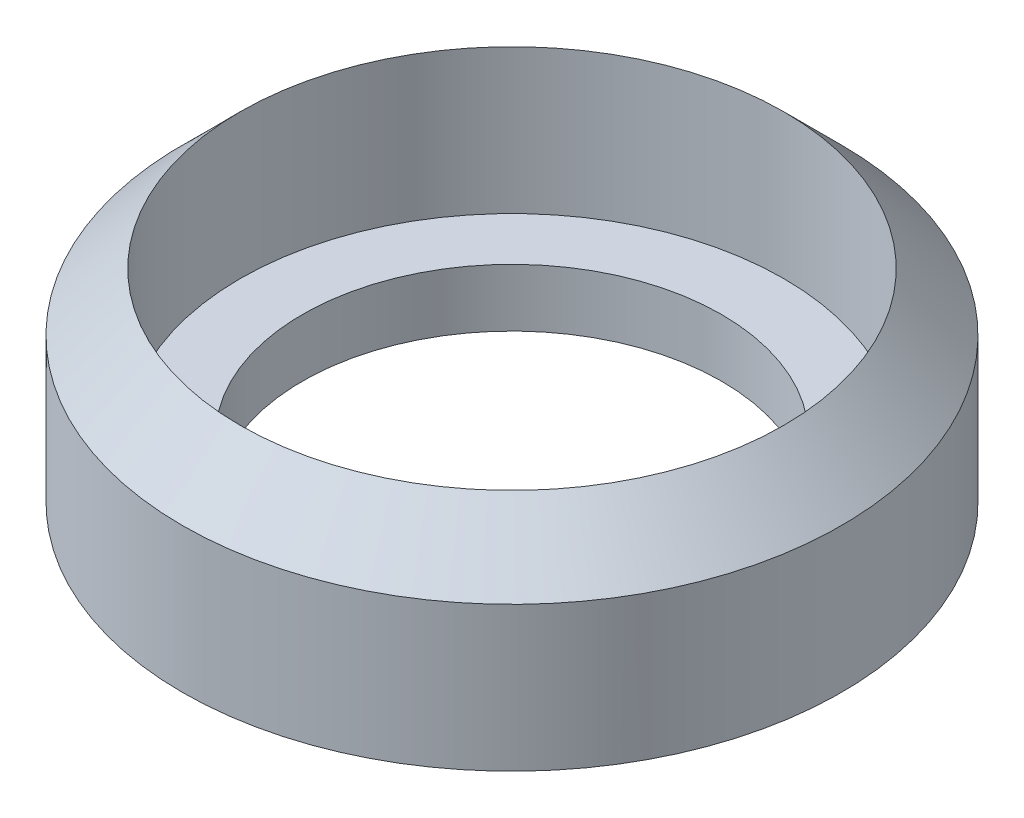
ISO-10303-21;
HEADER;
FILE_DESCRIPTION(('STEP AP214'),'2;1');
FILE_NAME('part.step','',(''),(''),'','','');
FILE_SCHEMA(('AUTOMOTIVE_DESIGN { 1 0 10303 214 1 1 1 1 }'));
ENDSEC;
DATA;
#1=APPLICATION_CONTEXT('core data for automotive mechanical design processes');
#2=APPLICATION_PROTOCOL_DEFINITION('international standard','automotive_design',2000,#1);
#3=PRODUCT_CONTEXT('',#1,'mechanical');
#4=PRODUCT('Part','Part','',(#3));
#5=PRODUCT_RELATED_PRODUCT_CATEGORY('part','',(#4));
#6=PRODUCT_DEFINITION_FORMATION('','',#4);
#7=PRODUCT_DEFINITION_CONTEXT('part definition',#1,'design');
#8=PRODUCT_DEFINITION('design','',#6,#7);
#9=PRODUCT_DEFINITION_SHAPE('','',#8);
#10=(LENGTH_UNIT() NAMED_UNIT(*) SI_UNIT(.MILLI.,.METRE.));
#11=(NAMED_UNIT(*) PLANE_ANGLE_UNIT() SI_UNIT($,.RADIAN.));
#12=(NAMED_UNIT(*) SI_UNIT($,.STERADIAN.) SOLID_ANGLE_UNIT());
#13=UNCERTAINTY_MEASURE_WITH_UNIT(LENGTH_MEASURE(1.E-05),#10,'distance_accuracy_value','');
#14=(GEOMETRIC_REPRESENTATION_CONTEXT(3) GLOBAL_UNCERTAINTY_ASSIGNED_CONTEXT((#13)) GLOBAL_UNIT_ASSIGNED_CONTEXT((#10,
#11,#12)) REPRESENTATION_CONTEXT('',''));
#15=CARTESIAN_POINT('',(0.,0.,0.));
#16=DIRECTION('',(0.,0.,1.));
#17=DIRECTION('',(1.,0.,0.));
#18=AXIS2_PLACEMENT_3D('',#15,#16,#17);
#19=CARTESIAN_POINT('',(36.2500000000001,0.,0.));
#20=DIRECTION('',(0.,1.,0.));
#21=DIRECTION('',(0.,0.,1.));
#22=AXIS2_PLACEMENT_3D('',#19,#20,#21);
#23=PLANE('',#22);
#24=CARTESIAN_POINT('',(0.,0.,0.));
#25=DIRECTION('',(0.,1.,0.));
#26=DIRECTION('',(0.,0.,1.));
#27=AXIS2_PLACEMENT_3D('',#24,#25,#26);
#28=CIRCLE('',#27,57.);
#29=CARTESIAN_POINT('',(0.,0.,57.));
#30=VERTEX_POINT('',#29);
#31=EDGE_CURVE('E50',#30,#30,#28,.T.);
#32=ORIENTED_EDGE('',*,*,#31,.F.);
#33=EDGE_LOOP('',(#32));
#34=FACE_BOUND('',#33,.T.);
#35=CARTESIAN_POINT('',(0.,0.,0.));
#36=DIRECTION('',(0.,1.,0.));
#37=DIRECTION('',(0.,0.,1.));
#38=AXIS2_PLACEMENT_3D('',#35,#36,#37);
#39=CIRCLE('',#38,36.2500000000001);
#40=CARTESIAN_POINT('',(0.,0.,36.2500000000001));
#41=VERTEX_POINT('',#40);
#42=EDGE_CURVE('E70',#41,#41,#39,.T.);
#43=ORIENTED_EDGE('',*,*,#42,.T.);
#44=EDGE_LOOP('',(#43));
#45=FACE_BOUND('',#44,.T.);
#46=ADVANCED_FACE('F41',(#34,#45),#23,.F.);
#47=CARTESIAN_POINT('',(0.,630.278330927536,0.));
#48=DIRECTION('',(0.,1.,0.));
#49=DIRECTION('',(0.,0.,1.));
#50=AXIS2_PLACEMENT_3D('',#47,#48,#49);
#51=CYLINDRICAL_SURFACE('',#50,57.0000000000001);
#52=CARTESIAN_POINT('',(0.,24.9999999999999,0.));
#53=DIRECTION('',(0.,-1.,0.));
#54=DIRECTION('',(0.,0.,-1.));
#55=AXIS2_PLACEMENT_3D('',#52,#53,#54);
#56=CIRCLE('',#55,57.0000000000001);
#57=CARTESIAN_POINT('',(0.,24.9999999999999,-57.0000000000001));
#58=VERTEX_POINT('',#57);
#59=EDGE_CURVE('E10',#58,#58,#56,.T.);
#60=ORIENTED_EDGE('',*,*,#59,.T.);
#61=EDGE_LOOP('',(#60));
#62=FACE_BOUND('',#61,.T.);
#63=ORIENTED_EDGE('',*,*,#31,.T.);
#64=EDGE_LOOP('',(#63));
#65=FACE_BOUND('',#64,.T.);
#66=ADVANCED_FACE('F91',(#62,#65),#51,.T.);
#67=CARTESIAN_POINT('',(0.,630.278330927536,0.));
#68=DIRECTION('',(0.,1.,0.));
#69=DIRECTION('',(0.,0.,1.));
#70=AXIS2_PLACEMENT_3D('',#67,#68,#69);
#71=CYLINDRICAL_SURFACE('',#70,47.0000000000001);
#72=CARTESIAN_POINT('',(0.,10.,0.));
#73=DIRECTION('',(0.,1.,0.));
#74=DIRECTION('',(0.,0.,1.));
#75=AXIS2_PLACEMENT_3D('',#72,#73,#74);
#76=CIRCLE('',#75,47.0000000000001);
#77=CARTESIAN_POINT('',(0.,10.,47.0000000000001));
#78=VERTEX_POINT('',#77);
#79=EDGE_CURVE('E60',#78,#78,#76,.T.);
#80=ORIENTED_EDGE('',*,*,#79,.F.);
#81=EDGE_LOOP('',(#80));
#82=FACE_BOUND('',#81,.T.);
#83=CARTESIAN_POINT('',(0.,35.,0.));
#84=DIRECTION('',(0.,1.,0.));
#85=DIRECTION('',(0.,0.,1.));
#86=AXIS2_PLACEMENT_3D('',#83,#84,#85);
#87=CIRCLE('',#86,47.0000000000001);
#88=CARTESIAN_POINT('',(0.,35.,47.0000000000001));
#89=VERTEX_POINT('',#88);
#90=EDGE_CURVE('E55',#89,#89,#87,.T.);
#91=ORIENTED_EDGE('',*,*,#90,.T.);
#92=EDGE_LOOP('',(#91));
#93=FACE_BOUND('',#92,.T.);
#94=ADVANCED_FACE('F85',(#82,#93),#71,.F.);
#95=CARTESIAN_POINT('',(47.0000000000001,9.99999999999999,0.));
#96=DIRECTION('',(0.,-1.,0.));
#97=DIRECTION('',(0.,0.,-1.));
#98=AXIS2_PLACEMENT_3D('',#95,#96,#97);
#99=PLANE('',#98);
#100=CARTESIAN_POINT('',(0.,10.,0.));
#101=DIRECTION('',(0.,1.,0.));
#102=DIRECTION('',(0.,0.,1.));
#103=AXIS2_PLACEMENT_3D('',#100,#101,#102);
#104=CIRCLE('',#103,36.2500000000001);
#105=CARTESIAN_POINT('',(0.,10.,36.2500000000001));
#106=VERTEX_POINT('',#105);
#107=EDGE_CURVE('E66',#106,#106,#104,.T.);
#108=ORIENTED_EDGE('',*,*,#107,.F.);
#109=EDGE_LOOP('',(#108));
#110=FACE_BOUND('',#109,.T.);
#111=ORIENTED_EDGE('',*,*,#79,.T.);
#112=EDGE_LOOP('',(#111));
#113=FACE_BOUND('',#112,.T.);
#114=ADVANCED_FACE('F79',(#110,#113),#99,.F.);
#115=CARTESIAN_POINT('',(0.,630.278330927536,0.));
#116=DIRECTION('',(0.,1.,0.));
#117=DIRECTION('',(0.,0.,1.));
#118=AXIS2_PLACEMENT_3D('',#115,#116,#117);
#119=CYLINDRICAL_SURFACE('',#118,36.2500000000001);
#120=ORIENTED_EDGE('',*,*,#42,.F.);
#121=EDGE_LOOP('',(#120));
#122=FACE_BOUND('',#121,.T.);
#123=ORIENTED_EDGE('',*,*,#107,.T.);
#124=EDGE_LOOP('',(#123));
#125=FACE_BOUND('',#124,.T.);
#126=ADVANCED_FACE('F76',(#122,#125),#119,.F.);
#127=CARTESIAN_POINT('',(0.,35.,0.));
#128=DIRECTION('',(0.,-1.,0.));
#129=DIRECTION('',(0.,0.,-1.));
#130=AXIS2_PLACEMENT_3D('',#127,#128,#129);
#131=CONICAL_SURFACE('',#130,47.0000000000001,0.785398163397442);
#132=ORIENTED_EDGE('',*,*,#59,.F.);
#133=EDGE_LOOP('',(#132));
#134=FACE_BOUND('',#133,.T.);
#135=ORIENTED_EDGE('',*,*,#90,.F.);
#136=EDGE_LOOP('',(#135));
#137=FACE_BOUND('',#136,.T.);
#138=ADVANCED_FACE('F44',(#134,#137),#131,.T.);
#139=CLOSED_SHELL('',(#46,#66,#94,#114,#126,#138));
#140=MANIFOLD_SOLID_BREP('B2',#139);
#141=ADVANCED_BREP_SHAPE_REPRESENTATION('',(#18,#140),#14);
#142=SHAPE_DEFINITION_REPRESENTATION(#9,#141);
ENDSEC;
END-ISO-10303-21;
